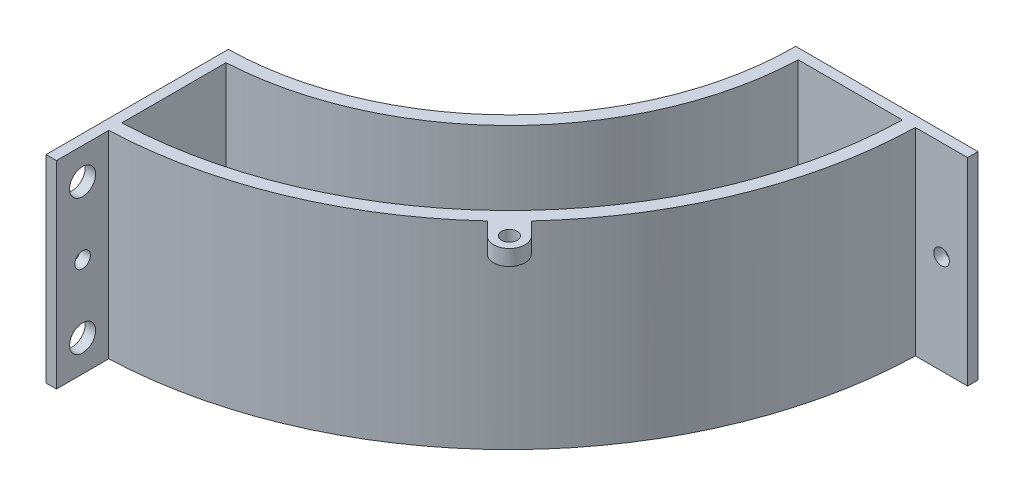
ISO-10303-21;
HEADER;
FILE_DESCRIPTION(('STEP AP214'),'2;1');
FILE_NAME('part.step','',(''),(''),'','','');
FILE_SCHEMA(('AUTOMOTIVE_DESIGN { 1 0 10303 214 1 1 1 1 }'));
ENDSEC;
DATA;
#1=APPLICATION_CONTEXT('core data for automotive mechanical design processes');
#2=APPLICATION_PROTOCOL_DEFINITION('international standard','automotive_design',2000,#1);
#3=PRODUCT_CONTEXT('',#1,'mechanical');
#4=PRODUCT('Part','Part','',(#3));
#5=PRODUCT_RELATED_PRODUCT_CATEGORY('part','',(#4));
#6=PRODUCT_DEFINITION_FORMATION('','',#4);
#7=PRODUCT_DEFINITION_CONTEXT('part definition',#1,'design');
#8=PRODUCT_DEFINITION('design','',#6,#7);
#9=PRODUCT_DEFINITION_SHAPE('','',#8);
#10=(LENGTH_UNIT() NAMED_UNIT(*) SI_UNIT(.MILLI.,.METRE.));
#11=(NAMED_UNIT(*) PLANE_ANGLE_UNIT() SI_UNIT($,.RADIAN.));
#12=(NAMED_UNIT(*) SI_UNIT($,.STERADIAN.) SOLID_ANGLE_UNIT());
#13=UNCERTAINTY_MEASURE_WITH_UNIT(LENGTH_MEASURE(1.E-05),#10,'distance_accuracy_value','');
#14=(GEOMETRIC_REPRESENTATION_CONTEXT(3) GLOBAL_UNCERTAINTY_ASSIGNED_CONTEXT((#13)) GLOBAL_UNIT_ASSIGNED_CONTEXT((#10,
#11,#12)) REPRESENTATION_CONTEXT('',''));
#15=CARTESIAN_POINT('',(0.,0.,0.));
#16=DIRECTION('',(0.,0.,1.));
#17=DIRECTION('',(1.,0.,0.));
#18=AXIS2_PLACEMENT_3D('',#15,#16,#17);
#19=CARTESIAN_POINT('',(0.,36.,0.));
#20=DIRECTION('',(0.,-1.,0.));
#21=DIRECTION('',(0.,0.,-1.));
#22=AXIS2_PLACEMENT_3D('',#19,#20,#21);
#23=CYLINDRICAL_SURFACE('',#22,80.);
#24=CARTESIAN_POINT('',(0.,33.,0.));
#25=DIRECTION('',(0.,1.,0.));
#26=DIRECTION('',(0.,0.,1.));
#27=AXIS2_PLACEMENT_3D('',#24,#25,#26);
#28=CIRCLE('',#27,80.);
#29=CARTESIAN_POINT('',(54.4074334017689,33.,58.6500740888882));
#30=VERTEX_POINT('',#29);
#31=CARTESIAN_POINT('',(58.6500740888882,33.,54.4074334017689));
#32=VERTEX_POINT('',#31);
#33=EDGE_CURVE('E11',#30,#32,#28,.T.);
#34=ORIENTED_EDGE('',*,*,#33,.F.);
#35=DIRECTION('',(0.,1.,0.));
#36=VECTOR('',#35,1.);
#37=CARTESIAN_POINT('',(54.4074334017689,33.,58.6500740888882));
#38=LINE('',#37,#36);
#39=CARTESIAN_POINT('',(54.4074334017689,36.,58.6500740888882));
#40=VERTEX_POINT('',#39);
#41=EDGE_CURVE('E186',#30,#40,#38,.T.);
#42=ORIENTED_EDGE('',*,*,#41,.T.);
#43=CARTESIAN_POINT('',(0.,36.,0.));
#44=DIRECTION('',(0.,1.,0.));
#45=DIRECTION('',(0.,0.,1.));
#46=AXIS2_PLACEMENT_3D('',#43,#44,#45);
#47=CIRCLE('',#46,80.);
#48=CARTESIAN_POINT('',(2.99999999999923,36.,79.9437302106926));
#49=VERTEX_POINT('',#48);
#50=EDGE_CURVE('E333',#49,#40,#47,.T.);
#51=ORIENTED_EDGE('',*,*,#50,.F.);
#52=DIRECTION('',(0.,-1.,0.));
#53=VECTOR('',#52,1.);
#54=CARTESIAN_POINT('',(2.99999999999923,36.,79.9437302106926));
#55=LINE('',#54,#53);
#56=CARTESIAN_POINT('',(2.99999999999923,-2.,79.9437302106926));
#57=VERTEX_POINT('',#56);
#58=EDGE_CURVE('E337',#49,#57,#55,.T.);
#59=ORIENTED_EDGE('',*,*,#58,.T.);
#60=CARTESIAN_POINT('',(0.,-2.,0.));
#61=DIRECTION('',(0.,1.,0.));
#62=DIRECTION('',(0.,0.,-1.));
#63=AXIS2_PLACEMENT_3D('',#60,#61,#62);
#64=CIRCLE('',#63,80.);
#65=CARTESIAN_POINT('',(79.9749960925288,-2.,2.));
#66=VERTEX_POINT('',#65);
#67=EDGE_CURVE('E291',#57,#66,#64,.T.);
#68=ORIENTED_EDGE('',*,*,#67,.T.);
#69=DIRECTION('',(0.,-1.,0.));
#70=VECTOR('',#69,1.);
#71=CARTESIAN_POINT('',(79.9749960925288,36.,2.));
#72=LINE('',#71,#70);
#73=CARTESIAN_POINT('',(79.9749960925288,36.,2.));
#74=VERTEX_POINT('',#73);
#75=EDGE_CURVE('E257',#74,#66,#72,.T.);
#76=ORIENTED_EDGE('',*,*,#75,.F.);
#77=CARTESIAN_POINT('',(58.6500740888882,36.,54.4074334017689));
#78=VERTEX_POINT('',#77);
#79=EDGE_CURVE('E332',#78,#74,#47,.T.);
#80=ORIENTED_EDGE('',*,*,#79,.F.);
#81=DIRECTION('',(0.,1.,0.));
#82=VECTOR('',#81,1.);
#83=CARTESIAN_POINT('',(58.6500740888882,33.,54.4074334017689));
#84=LINE('',#83,#82);
#85=EDGE_CURVE('E206',#32,#78,#84,.T.);
#86=ORIENTED_EDGE('',*,*,#85,.F.);
#87=EDGE_LOOP('',(#34,#42,#51,#59,#68,#76,#80,#86));
#88=FACE_BOUND('',#87,.T.);
#89=ADVANCED_FACE('F49',(#88),#23,.T.);
#90=CARTESIAN_POINT('',(0.,36.,0.));
#91=DIRECTION('',(0.,-1.,0.));
#92=DIRECTION('',(0.,0.,-1.));
#93=AXIS2_PLACEMENT_3D('',#90,#91,#92);
#94=CYLINDRICAL_SURFACE('',#93,57.5);
#95=CARTESIAN_POINT('',(0.,0.,0.));
#96=DIRECTION('',(0.,-1.,0.));
#97=DIRECTION('',(0.,0.,1.));
#98=AXIS2_PLACEMENT_3D('',#95,#96,#97);
#99=CIRCLE('',#98,57.5);
#100=CARTESIAN_POINT('',(57.4652068646759,0.,2.));
#101=VERTEX_POINT('',#100);
#102=CARTESIAN_POINT('',(2.99999999999746,0.,57.4216857990082));
#103=VERTEX_POINT('',#102);
#104=EDGE_CURVE('E294',#101,#103,#99,.T.);
#105=ORIENTED_EDGE('',*,*,#104,.F.);
#106=DIRECTION('',(0.,-1.,0.));
#107=VECTOR('',#106,1.);
#108=CARTESIAN_POINT('',(57.4652068646759,36.,2.));
#109=LINE('',#108,#107);
#110=CARTESIAN_POINT('',(57.4652068646759,36.,2.));
#111=VERTEX_POINT('',#110);
#112=EDGE_CURVE('E254',#101,#111,#109,.F.);
#113=ORIENTED_EDGE('',*,*,#112,.T.);
#114=CARTESIAN_POINT('',(0.,36.,0.));
#115=DIRECTION('',(0.,-1.,0.));
#116=DIRECTION('',(0.,0.,1.));
#117=AXIS2_PLACEMENT_3D('',#114,#115,#116);
#118=CIRCLE('',#117,57.5);
#119=CARTESIAN_POINT('',(2.99999999999746,36.,57.4216857990082));
#120=VERTEX_POINT('',#119);
#121=EDGE_CURVE('E295',#111,#120,#118,.T.);
#122=ORIENTED_EDGE('',*,*,#121,.T.);
#123=DIRECTION('',(0.,-1.,0.));
#124=VECTOR('',#123,1.);
#125=CARTESIAN_POINT('',(2.99999999999746,36.,57.4216857990082));
#126=LINE('',#125,#124);
#127=EDGE_CURVE('E316',#120,#103,#126,.T.);
#128=ORIENTED_EDGE('',*,*,#127,.T.);
#129=EDGE_LOOP('',(#105,#113,#122,#128));
#130=FACE_BOUND('',#129,.T.);
#131=ADVANCED_FACE('F377',(#130),#94,.T.);
#132=CARTESIAN_POINT('',(0.,36.,0.));
#133=DIRECTION('',(0.,-1.,0.));
#134=DIRECTION('',(0.,0.,-1.));
#135=AXIS2_PLACEMENT_3D('',#132,#133,#134);
#136=CYLINDRICAL_SURFACE('',#135,77.5);
#137=CARTESIAN_POINT('',(0.,36.,0.));
#138=DIRECTION('',(0.,1.,0.));
#139=DIRECTION('',(0.,0.,1.));
#140=AXIS2_PLACEMENT_3D('',#137,#138,#139);
#141=CIRCLE('',#140,77.5);
#142=CARTESIAN_POINT('',(2.99999999999904,36.,77.4419137160233));
#143=VERTEX_POINT('',#142);
#144=CARTESIAN_POINT('',(77.4741892503561,36.,2.));
#145=VERTEX_POINT('',#144);
#146=EDGE_CURVE('E302',#143,#145,#141,.T.);
#147=ORIENTED_EDGE('',*,*,#146,.T.);
#148=DIRECTION('',(0.,-1.,0.));
#149=VECTOR('',#148,1.);
#150=CARTESIAN_POINT('',(77.4741892503561,36.,2.));
#151=LINE('',#150,#149);
#152=CARTESIAN_POINT('',(77.4741892503561,0.,2.));
#153=VERTEX_POINT('',#152);
#154=EDGE_CURVE('E250',#145,#153,#151,.T.);
#155=ORIENTED_EDGE('',*,*,#154,.T.);
#156=CARTESIAN_POINT('',(0.,0.,0.));
#157=DIRECTION('',(0.,1.,0.));
#158=DIRECTION('',(0.,0.,1.));
#159=AXIS2_PLACEMENT_3D('',#156,#157,#158);
#160=CIRCLE('',#159,77.5);
#161=CARTESIAN_POINT('',(2.99999999999904,0.,77.4419137160233));
#162=VERTEX_POINT('',#161);
#163=EDGE_CURVE('E299',#162,#153,#160,.T.);
#164=ORIENTED_EDGE('',*,*,#163,.F.);
#165=DIRECTION('',(0.,-1.,0.));
#166=VECTOR('',#165,1.);
#167=CARTESIAN_POINT('',(2.99999999999904,36.,77.4419137160233));
#168=LINE('',#167,#166);
#169=EDGE_CURVE('E305',#143,#162,#168,.T.);
#170=ORIENTED_EDGE('',*,*,#169,.F.);
#171=EDGE_LOOP('',(#147,#155,#164,#170));
#172=FACE_BOUND('',#171,.T.);
#173=ADVANCED_FACE('F384',(#172),#136,.F.);
#174=CARTESIAN_POINT('',(0.,0.,0.));
#175=DIRECTION('',(0.,-1.,0.));
#176=DIRECTION('',(0.,0.,-1.));
#177=AXIS2_PLACEMENT_3D('',#174,#175,#176);
#178=PLANE('',#177);
#179=DIRECTION('',(1.,0.,0.));
#180=VECTOR('',#179,1.);
#181=CARTESIAN_POINT('',(0.,0.,2.));
#182=LINE('',#181,#180);
#183=EDGE_CURVE('E244',#101,#153,#182,.T.);
#184=ORIENTED_EDGE('',*,*,#183,.F.);
#185=ORIENTED_EDGE('',*,*,#104,.T.);
#186=DIRECTION('',(0.,0.,1.));
#187=VECTOR('',#186,1.);
#188=CARTESIAN_POINT('',(2.99999999999746,0.,57.4216857990082));
#189=LINE('',#188,#187);
#190=EDGE_CURVE('E308',#103,#162,#189,.T.);
#191=ORIENTED_EDGE('',*,*,#190,.T.);
#192=ORIENTED_EDGE('',*,*,#163,.T.);
#193=EDGE_LOOP('',(#184,#185,#191,#192));
#194=FACE_BOUND('',#193,.T.);
#195=ADVANCED_FACE('F465',(#194),#178,.F.);
#196=CARTESIAN_POINT('',(0.,36.,0.));
#197=DIRECTION('',(0.,1.,0.));
#198=DIRECTION('',(0.,0.,1.));
#199=AXIS2_PLACEMENT_3D('',#196,#197,#198);
#200=PLANE('',#199);
#201=ORIENTED_EDGE('',*,*,#50,.T.);
#202=DIRECTION('',(0.707106781186547,0.,0.707106781186547));
#203=VECTOR('',#202,1.);
#204=CARTESIAN_POINT('',(54.4074334017689,36.,58.6500740888882));
#205=LINE('',#204,#203);
#206=CARTESIAN_POINT('',(56.8823071359218,36.,61.1249478230411));
#207=VERTEX_POINT('',#206);
#208=EDGE_CURVE('E197',#40,#207,#205,.T.);
#209=ORIENTED_EDGE('',*,*,#208,.T.);
#210=CARTESIAN_POINT('',(59.0036274794815,36.,59.0036274794815));
#211=DIRECTION('',(0.,1.,0.));
#212=DIRECTION('',(0.,0.,1.));
#213=AXIS2_PLACEMENT_3D('',#210,#211,#212);
#214=CIRCLE('',#213,2.99999999999999);
#215=CARTESIAN_POINT('',(61.1249478230411,36.,56.8823071359218));
#216=VERTEX_POINT('',#215);
#217=EDGE_CURVE('E167',#207,#216,#214,.T.);
#218=ORIENTED_EDGE('',*,*,#217,.T.);
#219=DIRECTION('',(-0.707106781186549,0.,-0.707106781186545));
#220=VECTOR('',#219,1.);
#221=CARTESIAN_POINT('',(61.1249478230411,36.,56.8823071359218));
#222=LINE('',#221,#220);
#223=EDGE_CURVE('E65',#216,#78,#222,.T.);
#224=ORIENTED_EDGE('',*,*,#223,.T.);
#225=ORIENTED_EDGE('',*,*,#79,.T.);
#226=DIRECTION('',(-1.,0.,0.));
#227=VECTOR('',#226,1.);
#228=CARTESIAN_POINT('',(80.,36.,2.));
#229=LINE('',#228,#227);
#230=CARTESIAN_POINT('',(90.,36.,2.));
#231=VERTEX_POINT('',#230);
#232=EDGE_CURVE('E228',#231,#74,#229,.T.);
#233=ORIENTED_EDGE('',*,*,#232,.F.);
#234=DIRECTION('',(0.,0.,1.));
#235=VECTOR('',#234,1.);
#236=CARTESIAN_POINT('',(90.,36.,-2.));
#237=LINE('',#236,#235);
#238=CARTESIAN_POINT('',(90.,36.,0.));
#239=VERTEX_POINT('',#238);
#240=EDGE_CURVE('E241',#239,#231,#237,.T.);
#241=ORIENTED_EDGE('',*,*,#240,.F.);
#242=DIRECTION('',(1.,0.,0.));
#243=VECTOR('',#242,1.);
#244=CARTESIAN_POINT('',(0.,36.,0.));
#245=LINE('',#244,#243);
#246=CARTESIAN_POINT('',(55.,36.,0.));
#247=VERTEX_POINT('',#246);
#248=EDGE_CURVE('E73',#247,#239,#245,.T.);
#249=ORIENTED_EDGE('',*,*,#248,.F.);
#250=CARTESIAN_POINT('',(0.,36.,0.));
#251=DIRECTION('',(0.,-1.,0.));
#252=DIRECTION('',(0.,0.,1.));
#253=AXIS2_PLACEMENT_3D('',#250,#251,#252);
#254=CIRCLE('',#253,55.);
#255=CARTESIAN_POINT('',(1.00000000000094,36.,54.9909083394701));
#256=VERTEX_POINT('',#255);
#257=EDGE_CURVE('E320',#247,#256,#254,.T.);
#258=ORIENTED_EDGE('',*,*,#257,.T.);
#259=DIRECTION('',(0.,0.,1.));
#260=VECTOR('',#259,1.);
#261=CARTESIAN_POINT('',(1.00000000000094,36.,54.9909083394701));
#262=LINE('',#261,#260);
#263=CARTESIAN_POINT('',(1.00000000000002,36.,89.9937497558403));
#264=VERTEX_POINT('',#263);
#265=EDGE_CURVE('E323',#256,#264,#262,.T.);
#266=ORIENTED_EDGE('',*,*,#265,.T.);
#267=DIRECTION('',(1.,0.,0.));
#268=VECTOR('',#267,1.);
#269=CARTESIAN_POINT('',(3.00000000000002,36.,89.9937497558403));
#270=LINE('',#269,#268);
#271=CARTESIAN_POINT('',(3.00000000000002,36.,89.9937497558403));
#272=VERTEX_POINT('',#271);
#273=EDGE_CURVE('E326',#264,#272,#270,.T.);
#274=ORIENTED_EDGE('',*,*,#273,.T.);
#275=DIRECTION('',(0.,0.,-1.));
#276=VECTOR('',#275,1.);
#277=CARTESIAN_POINT('',(2.99999999999923,36.,79.9437302106926));
#278=LINE('',#277,#276);
#279=EDGE_CURVE('E329',#272,#49,#278,.T.);
#280=ORIENTED_EDGE('',*,*,#279,.T.);
#281=EDGE_LOOP('',(#201,#209,#218,#224,#225,#233,#241,#249,#258,#266,#274,#280));
#282=FACE_BOUND('',#281,.T.);
#283=EDGE_CURVE('E227',#145,#111,#229,.T.);
#284=ORIENTED_EDGE('',*,*,#283,.F.);
#285=ORIENTED_EDGE('',*,*,#146,.F.);
#286=DIRECTION('',(0.,0.,1.));
#287=VECTOR('',#286,1.);
#288=CARTESIAN_POINT('',(2.99999999999746,36.,57.4216857990082));
#289=LINE('',#288,#287);
#290=EDGE_CURVE('E298',#120,#143,#289,.T.);
#291=ORIENTED_EDGE('',*,*,#290,.F.);
#292=ORIENTED_EDGE('',*,*,#121,.F.);
#293=EDGE_LOOP('',(#284,#285,#291,#292));
#294=FACE_BOUND('',#293,.T.);
#295=CARTESIAN_POINT('',(59.0036274794815,36.,59.0036274794815));
#296=DIRECTION('',(0.,1.,0.));
#297=DIRECTION('',(0.,0.,1.));
#298=AXIS2_PLACEMENT_3D('',#295,#296,#297);
#299=CIRCLE('',#298,1.5);
#300=CARTESIAN_POINT('',(59.0036274794815,36.,60.5036274794815));
#301=VERTEX_POINT('',#300);
#302=EDGE_CURVE('E192',#301,#301,#299,.T.);
#303=ORIENTED_EDGE('',*,*,#302,.F.);
#304=EDGE_LOOP('',(#303));
#305=FACE_BOUND('',#304,.T.);
#306=ADVANCED_FACE('F389',(#282,#294,#305),#200,.T.);
#307=CARTESIAN_POINT('',(0.,36.,0.));
#308=DIRECTION('',(0.,-1.,0.));
#309=DIRECTION('',(0.,0.,-1.));
#310=AXIS2_PLACEMENT_3D('',#307,#308,#309);
#311=CYLINDRICAL_SURFACE('',#310,55.);
#312=ORIENTED_EDGE('',*,*,#257,.F.);
#313=DIRECTION('',(0.,-1.,0.));
#314=VECTOR('',#313,1.);
#315=CARTESIAN_POINT('',(55.,36.,0.));
#316=LINE('',#315,#314);
#317=CARTESIAN_POINT('',(55.,-2.,0.));
#318=VERTEX_POINT('',#317);
#319=EDGE_CURVE('E217',#247,#318,#316,.T.);
#320=ORIENTED_EDGE('',*,*,#319,.T.);
#321=CARTESIAN_POINT('',(0.,-2.,0.));
#322=DIRECTION('',(0.,-1.,0.));
#323=DIRECTION('',(0.,0.,1.));
#324=AXIS2_PLACEMENT_3D('',#321,#322,#323);
#325=CIRCLE('',#324,55.);
#326=CARTESIAN_POINT('',(1.00000000000094,-2.,54.9909083394701));
#327=VERTEX_POINT('',#326);
#328=EDGE_CURVE('E276',#318,#327,#325,.T.);
#329=ORIENTED_EDGE('',*,*,#328,.T.);
#330=DIRECTION('',(0.,-1.,0.));
#331=VECTOR('',#330,1.);
#332=CARTESIAN_POINT('',(1.00000000000094,36.,54.9909083394701));
#333=LINE('',#332,#331);
#334=EDGE_CURVE('E58',#256,#327,#333,.T.);
#335=ORIENTED_EDGE('',*,*,#334,.F.);
#336=EDGE_LOOP('',(#312,#320,#329,#335));
#337=FACE_BOUND('',#336,.T.);
#338=ADVANCED_FACE('F51',(#337),#311,.F.);
#339=CARTESIAN_POINT('',(1.00000000000094,36.,54.9909083394701));
#340=DIRECTION('',(1.,0.,0.));
#341=DIRECTION('',(0.,0.,-1.));
#342=AXIS2_PLACEMENT_3D('',#339,#340,#341);
#343=PLANE('',#342);
#344=CARTESIAN_POINT('',(1.00000000000015,17.,84.9687399832664));
#345=DIRECTION('',(1.,0.,0.));
#346=DIRECTION('',(0.,0.,-1.));
#347=AXIS2_PLACEMENT_3D('',#344,#345,#346);
#348=CIRCLE('',#347,1.5);
#349=CARTESIAN_POINT('',(1.00000000000019,17.,83.4687399832664));
#350=VERTEX_POINT('',#349);
#351=EDGE_CURVE('E272',#350,#350,#348,.F.);
#352=ORIENTED_EDGE('',*,*,#351,.F.);
#353=EDGE_LOOP('',(#352));
#354=FACE_BOUND('',#353,.T.);
#355=CARTESIAN_POINT('',(1.00000000000015,4.,84.9687399832664));
#356=DIRECTION('',(1.,0.,0.));
#357=DIRECTION('',(0.,0.,-1.));
#358=AXIS2_PLACEMENT_3D('',#355,#356,#357);
#359=CIRCLE('',#358,2.50000000000001);
#360=CARTESIAN_POINT('',(1.00000000000022,4.,82.4687399832664));
#361=VERTEX_POINT('',#360);
#362=EDGE_CURVE('E267',#361,#361,#359,.F.);
#363=ORIENTED_EDGE('',*,*,#362,.F.);
#364=EDGE_LOOP('',(#363));
#365=FACE_BOUND('',#364,.T.);
#366=CARTESIAN_POINT('',(1.00000000000015,30.,84.9687399832664));
#367=DIRECTION('',(1.,0.,0.));
#368=DIRECTION('',(0.,0.,-1.));
#369=AXIS2_PLACEMENT_3D('',#366,#367,#368);
#370=CIRCLE('',#369,2.50000000000001);
#371=CARTESIAN_POINT('',(1.00000000000022,30.,82.4687399832664));
#372=VERTEX_POINT('',#371);
#373=EDGE_CURVE('E262',#372,#372,#370,.F.);
#374=ORIENTED_EDGE('',*,*,#373,.F.);
#375=EDGE_LOOP('',(#374));
#376=FACE_BOUND('',#375,.T.);
#377=ORIENTED_EDGE('',*,*,#334,.T.);
#378=DIRECTION('',(0.,0.,1.));
#379=VECTOR('',#378,1.);
#380=CARTESIAN_POINT('',(1.00000000000002,-2.,89.9937497558403));
#381=LINE('',#380,#379);
#382=CARTESIAN_POINT('',(1.00000000000002,-2.,89.9937497558403));
#383=VERTEX_POINT('',#382);
#384=EDGE_CURVE('E279',#327,#383,#381,.T.);
#385=ORIENTED_EDGE('',*,*,#384,.T.);
#386=DIRECTION('',(0.,-1.,0.));
#387=VECTOR('',#386,1.);
#388=CARTESIAN_POINT('',(1.00000000000002,36.,89.9937497558403));
#389=LINE('',#388,#387);
#390=EDGE_CURVE('E343',#264,#383,#389,.T.);
#391=ORIENTED_EDGE('',*,*,#390,.F.);
#392=ORIENTED_EDGE('',*,*,#265,.F.);
#393=EDGE_LOOP('',(#377,#385,#391,#392));
#394=FACE_BOUND('',#393,.T.);
#395=ADVANCED_FACE('F397',(#354,#365,#376,#394),#343,.F.);
#396=CARTESIAN_POINT('',(3.00000000000002,36.,89.9937497558403));
#397=DIRECTION('',(0.,0.,-1.));
#398=DIRECTION('',(-1.,0.,0.));
#399=AXIS2_PLACEMENT_3D('',#396,#397,#398);
#400=PLANE('',#399);
#401=ORIENTED_EDGE('',*,*,#390,.T.);
#402=DIRECTION('',(1.,0.,0.));
#403=VECTOR('',#402,1.);
#404=CARTESIAN_POINT('',(3.00000000000002,-2.,89.9937497558403));
#405=LINE('',#404,#403);
#406=CARTESIAN_POINT('',(3.00000000000002,-2.,89.9937497558403));
#407=VERTEX_POINT('',#406);
#408=EDGE_CURVE('E283',#383,#407,#405,.T.);
#409=ORIENTED_EDGE('',*,*,#408,.T.);
#410=DIRECTION('',(0.,-1.,0.));
#411=VECTOR('',#410,1.);
#412=CARTESIAN_POINT('',(3.00000000000002,36.,89.9937497558403));
#413=LINE('',#412,#411);
#414=EDGE_CURVE('E340',#272,#407,#413,.T.);
#415=ORIENTED_EDGE('',*,*,#414,.F.);
#416=ORIENTED_EDGE('',*,*,#273,.F.);
#417=EDGE_LOOP('',(#401,#409,#415,#416));
#418=FACE_BOUND('',#417,.T.);
#419=ADVANCED_FACE('F394',(#418),#400,.F.);
#420=CARTESIAN_POINT('',(2.99999999999923,36.,79.9437302106926));
#421=DIRECTION('',(-1.,0.,0.));
#422=DIRECTION('',(0.,0.,1.));
#423=AXIS2_PLACEMENT_3D('',#420,#421,#422);
#424=PLANE('',#423);
#425=CARTESIAN_POINT('',(2.99999999999963,17.,84.9687399832664));
#426=DIRECTION('',(-1.,0.,0.));
#427=DIRECTION('',(0.,0.,1.));
#428=AXIS2_PLACEMENT_3D('',#425,#426,#427);
#429=CIRCLE('',#428,1.5);
#430=CARTESIAN_POINT('',(2.99999999999975,17.,86.4687399832664));
#431=VERTEX_POINT('',#430);
#432=EDGE_CURVE('E271',#431,#431,#429,.F.);
#433=ORIENTED_EDGE('',*,*,#432,.F.);
#434=EDGE_LOOP('',(#433));
#435=FACE_BOUND('',#434,.T.);
#436=CARTESIAN_POINT('',(2.99999999999963,4.,84.9687399832664));
#437=DIRECTION('',(-1.,0.,0.));
#438=DIRECTION('',(0.,0.,1.));
#439=AXIS2_PLACEMENT_3D('',#436,#437,#438);
#440=CIRCLE('',#439,2.50000000000001);
#441=CARTESIAN_POINT('',(2.99999999999982,4.,87.4687399832664));
#442=VERTEX_POINT('',#441);
#443=EDGE_CURVE('E266',#442,#442,#440,.F.);
#444=ORIENTED_EDGE('',*,*,#443,.F.);
#445=EDGE_LOOP('',(#444));
#446=FACE_BOUND('',#445,.T.);
#447=CARTESIAN_POINT('',(2.99999999999963,30.,84.9687399832664));
#448=DIRECTION('',(-1.,0.,0.));
#449=DIRECTION('',(0.,0.,1.));
#450=AXIS2_PLACEMENT_3D('',#447,#448,#449);
#451=CIRCLE('',#450,2.50000000000001);
#452=CARTESIAN_POINT('',(2.99999999999982,30.,87.4687399832665));
#453=VERTEX_POINT('',#452);
#454=EDGE_CURVE('E261',#453,#453,#451,.F.);
#455=ORIENTED_EDGE('',*,*,#454,.F.);
#456=EDGE_LOOP('',(#455));
#457=FACE_BOUND('',#456,.T.);
#458=ORIENTED_EDGE('',*,*,#414,.T.);
#459=DIRECTION('',(0.,0.,-1.));
#460=VECTOR('',#459,1.);
#461=CARTESIAN_POINT('',(2.99999999999923,-2.,79.9437302106926));
#462=LINE('',#461,#460);
#463=EDGE_CURVE('E287',#407,#57,#462,.T.);
#464=ORIENTED_EDGE('',*,*,#463,.T.);
#465=ORIENTED_EDGE('',*,*,#58,.F.);
#466=ORIENTED_EDGE('',*,*,#279,.F.);
#467=EDGE_LOOP('',(#458,#464,#465,#466));
#468=FACE_BOUND('',#467,.T.);
#469=ADVANCED_FACE('F390',(#435,#446,#457,#468),#424,.F.);
#470=CARTESIAN_POINT('',(2.99999999999746,36.,57.4216857990082));
#471=DIRECTION('',(1.,0.,0.));
#472=DIRECTION('',(0.,0.,-1.));
#473=AXIS2_PLACEMENT_3D('',#470,#471,#472);
#474=PLANE('',#473);
#475=ORIENTED_EDGE('',*,*,#190,.F.);
#476=ORIENTED_EDGE('',*,*,#127,.F.);
#477=ORIENTED_EDGE('',*,*,#290,.T.);
#478=ORIENTED_EDGE('',*,*,#169,.T.);
#479=EDGE_LOOP('',(#475,#476,#477,#478));
#480=FACE_BOUND('',#479,.T.);
#481=ADVANCED_FACE('F393',(#480),#474,.T.);
#482=CARTESIAN_POINT('',(0.,-2.,0.));
#483=DIRECTION('',(0.,-1.,0.));
#484=DIRECTION('',(0.,0.,-1.));
#485=AXIS2_PLACEMENT_3D('',#482,#483,#484);
#486=PLANE('',#485);
#487=DIRECTION('',(-1.,0.,0.));
#488=VECTOR('',#487,1.);
#489=CARTESIAN_POINT('',(0.,-2.,0.));
#490=LINE('',#489,#488);
#491=CARTESIAN_POINT('',(90.,-2.,0.));
#492=VERTEX_POINT('',#491);
#493=EDGE_CURVE('E214',#492,#318,#490,.T.);
#494=ORIENTED_EDGE('',*,*,#493,.F.);
#495=DIRECTION('',(0.,0.,1.));
#496=VECTOR('',#495,1.);
#497=CARTESIAN_POINT('',(90.,-2.,-2.));
#498=LINE('',#497,#496);
#499=CARTESIAN_POINT('',(90.,-2.,2.));
#500=VERTEX_POINT('',#499);
#501=EDGE_CURVE('E240',#492,#500,#498,.T.);
#502=ORIENTED_EDGE('',*,*,#501,.T.);
#503=DIRECTION('',(1.,0.,0.));
#504=VECTOR('',#503,1.);
#505=CARTESIAN_POINT('',(80.,-2.,2.));
#506=LINE('',#505,#504);
#507=EDGE_CURVE('E232',#66,#500,#506,.T.);
#508=ORIENTED_EDGE('',*,*,#507,.F.);
#509=ORIENTED_EDGE('',*,*,#67,.F.);
#510=ORIENTED_EDGE('',*,*,#463,.F.);
#511=ORIENTED_EDGE('',*,*,#408,.F.);
#512=ORIENTED_EDGE('',*,*,#384,.F.);
#513=ORIENTED_EDGE('',*,*,#328,.F.);
#514=EDGE_LOOP('',(#494,#502,#508,#509,#510,#511,#512,#513));
#515=FACE_BOUND('',#514,.T.);
#516=ADVANCED_FACE('F419',(#515),#486,.T.);
#517=CARTESIAN_POINT('',(80.,30.,84.9687399832664));
#518=DIRECTION('',(-1.,0.,0.));
#519=DIRECTION('',(0.,0.,1.));
#520=AXIS2_PLACEMENT_3D('',#517,#518,#519);
#521=CYLINDRICAL_SURFACE('',#520,2.50000000000001);
#522=ORIENTED_EDGE('',*,*,#454,.T.);
#523=EDGE_LOOP('',(#522));
#524=FACE_BOUND('',#523,.T.);
#525=ORIENTED_EDGE('',*,*,#373,.T.);
#526=EDGE_LOOP('',(#525));
#527=FACE_BOUND('',#526,.T.);
#528=ADVANCED_FACE('F483',(#524,#527),#521,.F.);
#529=CARTESIAN_POINT('',(80.,4.,84.9687399832664));
#530=DIRECTION('',(-1.,0.,0.));
#531=DIRECTION('',(0.,0.,1.));
#532=AXIS2_PLACEMENT_3D('',#529,#530,#531);
#533=CYLINDRICAL_SURFACE('',#532,2.50000000000001);
#534=ORIENTED_EDGE('',*,*,#443,.T.);
#535=EDGE_LOOP('',(#534));
#536=FACE_BOUND('',#535,.T.);
#537=ORIENTED_EDGE('',*,*,#362,.T.);
#538=EDGE_LOOP('',(#537));
#539=FACE_BOUND('',#538,.T.);
#540=ADVANCED_FACE('F549',(#536,#539),#533,.F.);
#541=CARTESIAN_POINT('',(80.,17.,84.9687399832664));
#542=DIRECTION('',(-1.,0.,0.));
#543=DIRECTION('',(0.,0.,1.));
#544=AXIS2_PLACEMENT_3D('',#541,#542,#543);
#545=CYLINDRICAL_SURFACE('',#544,1.5);
#546=ORIENTED_EDGE('',*,*,#432,.T.);
#547=EDGE_LOOP('',(#546));
#548=FACE_BOUND('',#547,.T.);
#549=ORIENTED_EDGE('',*,*,#351,.T.);
#550=EDGE_LOOP('',(#549));
#551=FACE_BOUND('',#550,.T.);
#552=ADVANCED_FACE('F544',(#548,#551),#545,.F.);
#553=CARTESIAN_POINT('',(0.,0.,2.));
#554=DIRECTION('',(0.,0.,-1.));
#555=DIRECTION('',(-1.,0.,0.));
#556=AXIS2_PLACEMENT_3D('',#553,#554,#555);
#557=PLANE('',#556);
#558=ORIENTED_EDGE('',*,*,#112,.F.);
#559=ORIENTED_EDGE('',*,*,#183,.T.);
#560=ORIENTED_EDGE('',*,*,#154,.F.);
#561=ORIENTED_EDGE('',*,*,#283,.T.);
#562=EDGE_LOOP('',(#558,#559,#560,#561));
#563=FACE_BOUND('',#562,.T.);
#564=ADVANCED_FACE('F497',(#563),#557,.F.);
#565=CARTESIAN_POINT('',(85.,17.,2.));
#566=DIRECTION('',(0.,0.,1.));
#567=DIRECTION('',(1.,0.,0.));
#568=AXIS2_PLACEMENT_3D('',#565,#566,#567);
#569=CIRCLE('',#568,1.5);
#570=CARTESIAN_POINT('',(86.5,17.,2.));
#571=VERTEX_POINT('',#570);
#572=EDGE_CURVE('E223',#571,#571,#569,.T.);
#573=ORIENTED_EDGE('',*,*,#572,.F.);
#574=EDGE_LOOP('',(#573));
#575=FACE_BOUND('',#574,.T.);
#576=ORIENTED_EDGE('',*,*,#232,.T.);
#577=ORIENTED_EDGE('',*,*,#75,.T.);
#578=ORIENTED_EDGE('',*,*,#507,.T.);
#579=DIRECTION('',(0.,1.,0.));
#580=VECTOR('',#579,1.);
#581=CARTESIAN_POINT('',(90.,36.,2.));
#582=LINE('',#581,#580);
#583=EDGE_CURVE('E236',#500,#231,#582,.T.);
#584=ORIENTED_EDGE('',*,*,#583,.T.);
#585=EDGE_LOOP('',(#576,#577,#578,#584));
#586=FACE_BOUND('',#585,.T.);
#587=ADVANCED_FACE('F434',(#575,#586),#557,.F.);
#588=CARTESIAN_POINT('',(90.,36.,-2.));
#589=DIRECTION('',(1.,0.,0.));
#590=DIRECTION('',(0.,0.,-1.));
#591=AXIS2_PLACEMENT_3D('',#588,#589,#590);
#592=PLANE('',#591);
#593=DIRECTION('',(0.,-1.,0.));
#594=VECTOR('',#593,1.);
#595=CARTESIAN_POINT('',(90.,36.,0.));
#596=LINE('',#595,#594);
#597=EDGE_CURVE('E211',#239,#492,#596,.T.);
#598=ORIENTED_EDGE('',*,*,#597,.F.);
#599=ORIENTED_EDGE('',*,*,#240,.T.);
#600=ORIENTED_EDGE('',*,*,#583,.F.);
#601=ORIENTED_EDGE('',*,*,#501,.F.);
#602=EDGE_LOOP('',(#598,#599,#600,#601));
#603=FACE_BOUND('',#602,.T.);
#604=ADVANCED_FACE('F373',(#603),#592,.T.);
#605=CARTESIAN_POINT('',(85.,17.,-2.));
#606=DIRECTION('',(0.,0.,1.));
#607=DIRECTION('',(1.,0.,0.));
#608=AXIS2_PLACEMENT_3D('',#605,#606,#607);
#609=CYLINDRICAL_SURFACE('',#608,1.5);
#610=CARTESIAN_POINT('',(85.,17.,0.));
#611=DIRECTION('',(0.,0.,1.));
#612=DIRECTION('',(1.,0.,0.));
#613=AXIS2_PLACEMENT_3D('',#610,#611,#612);
#614=CIRCLE('',#613,1.5);
#615=CARTESIAN_POINT('',(86.5,17.,0.));
#616=VERTEX_POINT('',#615);
#617=EDGE_CURVE('E205',#616,#616,#614,.F.);
#618=ORIENTED_EDGE('',*,*,#617,.T.);
#619=EDGE_LOOP('',(#618));
#620=FACE_BOUND('',#619,.T.);
#621=ORIENTED_EDGE('',*,*,#572,.T.);
#622=EDGE_LOOP('',(#621));
#623=FACE_BOUND('',#622,.T.);
#624=ADVANCED_FACE('F362',(#620,#623),#609,.F.);
#625=CARTESIAN_POINT('',(0.,0.,0.));
#626=DIRECTION('',(0.,0.,1.));
#627=DIRECTION('',(1.,0.,0.));
#628=AXIS2_PLACEMENT_3D('',#625,#626,#627);
#629=PLANE('',#628);
#630=ORIENTED_EDGE('',*,*,#248,.T.);
#631=ORIENTED_EDGE('',*,*,#597,.T.);
#632=ORIENTED_EDGE('',*,*,#493,.T.);
#633=ORIENTED_EDGE('',*,*,#319,.F.);
#634=EDGE_LOOP('',(#630,#631,#632,#633));
#635=FACE_BOUND('',#634,.T.);
#636=ORIENTED_EDGE('',*,*,#617,.F.);
#637=EDGE_LOOP('',(#636));
#638=FACE_BOUND('',#637,.T.);
#639=ADVANCED_FACE('F365',(#635,#638),#629,.F.);
#640=CARTESIAN_POINT('',(54.4074334017689,33.,58.6500740888882));
#641=DIRECTION('',(-0.707106781186548,0.,0.707106781186548));
#642=DIRECTION('',(0.707106781186548,0.,0.707106781186548));
#643=AXIS2_PLACEMENT_3D('',#640,#641,#642);
#644=PLANE('',#643);
#645=ORIENTED_EDGE('',*,*,#208,.F.);
#646=ORIENTED_EDGE('',*,*,#41,.F.);
#647=DIRECTION('',(0.707106781186547,0.,0.707106781186547));
#648=VECTOR('',#647,1.);
#649=CARTESIAN_POINT('',(54.4074334017689,33.,58.6500740888882));
#650=LINE('',#649,#648);
#651=CARTESIAN_POINT('',(56.8823071359218,33.,61.1249478230411));
#652=VERTEX_POINT('',#651);
#653=EDGE_CURVE('E179',#30,#652,#650,.T.);
#654=ORIENTED_EDGE('',*,*,#653,.T.);
#655=DIRECTION('',(0.,1.,0.));
#656=VECTOR('',#655,1.);
#657=CARTESIAN_POINT('',(56.8823071359218,33.,61.1249478230411));
#658=LINE('',#657,#656);
#659=EDGE_CURVE('E163',#652,#207,#658,.T.);
#660=ORIENTED_EDGE('',*,*,#659,.T.);
#661=EDGE_LOOP('',(#645,#646,#654,#660));
#662=FACE_BOUND('',#661,.T.);
#663=ADVANCED_FACE('F184',(#662),#644,.T.);
#664=CARTESIAN_POINT('',(61.1249478230411,33.,56.8823071359218));
#665=DIRECTION('',(0.707106781186546,0.,-0.70710678118655));
#666=DIRECTION('',(-0.70710678118655,0.,-0.707106781186546));
#667=AXIS2_PLACEMENT_3D('',#664,#665,#666);
#668=PLANE('',#667);
#669=ORIENTED_EDGE('',*,*,#223,.F.);
#670=DIRECTION('',(0.,1.,0.));
#671=VECTOR('',#670,1.);
#672=CARTESIAN_POINT('',(61.1249478230411,33.,56.8823071359218));
#673=LINE('',#672,#671);
#674=CARTESIAN_POINT('',(61.1249478230411,33.,56.8823071359218));
#675=VERTEX_POINT('',#674);
#676=EDGE_CURVE('E172',#675,#216,#673,.T.);
#677=ORIENTED_EDGE('',*,*,#676,.F.);
#678=DIRECTION('',(-0.707106781186549,0.,-0.707106781186545));
#679=VECTOR('',#678,1.);
#680=CARTESIAN_POINT('',(61.1249478230411,33.,56.8823071359218));
#681=LINE('',#680,#679);
#682=EDGE_CURVE('E173',#675,#32,#681,.T.);
#683=ORIENTED_EDGE('',*,*,#682,.T.);
#684=ORIENTED_EDGE('',*,*,#85,.T.);
#685=EDGE_LOOP('',(#669,#677,#683,#684));
#686=FACE_BOUND('',#685,.T.);
#687=ADVANCED_FACE('F371',(#686),#668,.T.);
#688=CARTESIAN_POINT('',(59.0036274794815,33.,59.0036274794815));
#689=DIRECTION('',(0.,1.,0.));
#690=DIRECTION('',(0.,0.,1.));
#691=AXIS2_PLACEMENT_3D('',#688,#689,#690);
#692=CYLINDRICAL_SURFACE('',#691,2.99999999999999);
#693=ORIENTED_EDGE('',*,*,#217,.F.);
#694=ORIENTED_EDGE('',*,*,#659,.F.);
#695=CARTESIAN_POINT('',(59.0036274794815,33.,59.0036274794815));
#696=DIRECTION('',(0.,1.,0.));
#697=DIRECTION('',(0.,0.,1.));
#698=AXIS2_PLACEMENT_3D('',#695,#696,#697);
#699=CIRCLE('',#698,2.99999999999999);
#700=EDGE_CURVE('E166',#652,#675,#699,.T.);
#701=ORIENTED_EDGE('',*,*,#700,.T.);
#702=ORIENTED_EDGE('',*,*,#676,.T.);
#703=EDGE_LOOP('',(#693,#694,#701,#702));
#704=FACE_BOUND('',#703,.T.);
#705=ADVANCED_FACE('F165',(#704),#692,.T.);
#706=CARTESIAN_POINT('',(59.0036274794815,33.,59.0036274794815));
#707=DIRECTION('',(0.,1.,0.));
#708=DIRECTION('',(0.,0.,1.));
#709=AXIS2_PLACEMENT_3D('',#706,#707,#708);
#710=PLANE('',#709);
#711=CARTESIAN_POINT('',(59.0036274794815,33.,59.0036274794815));
#712=DIRECTION('',(0.,1.,0.));
#713=DIRECTION('',(0.,0.,1.));
#714=AXIS2_PLACEMENT_3D('',#711,#712,#713);
#715=CIRCLE('',#714,1.5);
#716=CARTESIAN_POINT('',(59.0036274794815,33.,60.5036274794815));
#717=VERTEX_POINT('',#716);
#718=EDGE_CURVE('E200',#717,#717,#715,.T.);
#719=ORIENTED_EDGE('',*,*,#718,.T.);
#720=EDGE_LOOP('',(#719));
#721=FACE_BOUND('',#720,.T.);
#722=ORIENTED_EDGE('',*,*,#653,.F.);
#723=ORIENTED_EDGE('',*,*,#33,.T.);
#724=ORIENTED_EDGE('',*,*,#682,.F.);
#725=ORIENTED_EDGE('',*,*,#700,.F.);
#726=EDGE_LOOP('',(#722,#723,#724,#725));
#727=FACE_BOUND('',#726,.T.);
#728=ADVANCED_FACE('F178',(#721,#727),#710,.F.);
#729=CARTESIAN_POINT('',(59.0036274794815,33.,59.0036274794815));
#730=DIRECTION('',(0.,1.,0.));
#731=DIRECTION('',(0.,0.,1.));
#732=AXIS2_PLACEMENT_3D('',#729,#730,#731);
#733=CYLINDRICAL_SURFACE('',#732,1.5);
#734=ORIENTED_EDGE('',*,*,#718,.F.);
#735=EDGE_LOOP('',(#734));
#736=FACE_BOUND('',#735,.T.);
#737=ORIENTED_EDGE('',*,*,#302,.T.);
#738=EDGE_LOOP('',(#737));
#739=FACE_BOUND('',#738,.T.);
#740=ADVANCED_FACE('F451',(#736,#739),#733,.F.);
#741=CLOSED_SHELL('',(#89,#131,#173,#195,#306,#338,#395,#419,#469,#481,#516,#528,#540,#552,#564,
#587,#604,#624,#639,#663,#687,#705,#728,#740));
#742=MANIFOLD_SOLID_BREP('B2',#741);
#743=ADVANCED_BREP_SHAPE_REPRESENTATION('',(#18,#742),#14);
#744=SHAPE_DEFINITION_REPRESENTATION(#9,#743);
ENDSEC;
END-ISO-10303-21;
